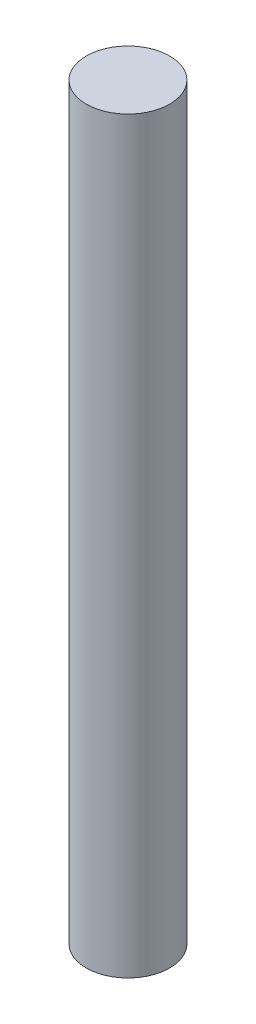
ISO-10303-21;
HEADER;
FILE_DESCRIPTION(('STEP AP214'),'2;1');
FILE_NAME('part.step','',(''),(''),'','','');
FILE_SCHEMA(('AUTOMOTIVE_DESIGN { 1 0 10303 214 1 1 1 1 }'));
ENDSEC;
DATA;
#1=APPLICATION_CONTEXT('core data for automotive mechanical design processes');
#2=APPLICATION_PROTOCOL_DEFINITION('international standard','automotive_design',2000,#1);
#3=PRODUCT_CONTEXT('',#1,'mechanical');
#4=PRODUCT('Part','Part','',(#3));
#5=PRODUCT_RELATED_PRODUCT_CATEGORY('part','',(#4));
#6=PRODUCT_DEFINITION_FORMATION('','',#4);
#7=PRODUCT_DEFINITION_CONTEXT('part definition',#1,'design');
#8=PRODUCT_DEFINITION('design','',#6,#7);
#9=PRODUCT_DEFINITION_SHAPE('','',#8);
#10=(LENGTH_UNIT() NAMED_UNIT(*) SI_UNIT(.MILLI.,.METRE.));
#11=(NAMED_UNIT(*) PLANE_ANGLE_UNIT() SI_UNIT($,.RADIAN.));
#12=(NAMED_UNIT(*) SI_UNIT($,.STERADIAN.) SOLID_ANGLE_UNIT());
#13=UNCERTAINTY_MEASURE_WITH_UNIT(LENGTH_MEASURE(1.E-05),#10,'distance_accuracy_value','');
#14=(GEOMETRIC_REPRESENTATION_CONTEXT(3) GLOBAL_UNCERTAINTY_ASSIGNED_CONTEXT((#13)) GLOBAL_UNIT_ASSIGNED_CONTEXT((#10,
#11,#12)) REPRESENTATION_CONTEXT('',''));
#15=CARTESIAN_POINT('',(0.,0.,0.));
#16=DIRECTION('',(0.,0.,1.));
#17=DIRECTION('',(1.,0.,0.));
#18=AXIS2_PLACEMENT_3D('',#15,#16,#17);
#19=CARTESIAN_POINT('',(0.,-370.,0.));
#20=DIRECTION('',(0.,1.,0.));
#21=DIRECTION('',(0.,0.,1.));
#22=AXIS2_PLACEMENT_3D('',#19,#20,#21);
#23=CYLINDRICAL_SURFACE('',#22,26.2);
#24=CARTESIAN_POINT('',(0.,-370.,0.));
#25=DIRECTION('',(0.,1.,0.));
#26=DIRECTION('',(0.,0.,1.));
#27=AXIS2_PLACEMENT_3D('',#24,#25,#26);
#28=CIRCLE('',#27,26.2);
#29=CARTESIAN_POINT('',(0.,-370.,26.2));
#30=VERTEX_POINT('',#29);
#31=EDGE_CURVE('E10',#30,#30,#28,.T.);
#32=ORIENTED_EDGE('',*,*,#31,.T.);
#33=EDGE_LOOP('',(#32));
#34=FACE_BOUND('',#33,.T.);
#35=CARTESIAN_POINT('',(0.,100.,0.));
#36=DIRECTION('',(0.,1.,0.));
#37=DIRECTION('',(0.,0.,1.));
#38=AXIS2_PLACEMENT_3D('',#35,#36,#37);
#39=CIRCLE('',#38,26.2);
#40=CARTESIAN_POINT('',(0.,100.,26.2));
#41=VERTEX_POINT('',#40);
#42=EDGE_CURVE('E48',#41,#41,#39,.T.);
#43=ORIENTED_EDGE('',*,*,#42,.F.);
#44=EDGE_LOOP('',(#43));
#45=FACE_BOUND('',#44,.T.);
#46=ADVANCED_FACE('F41',(#34,#45),#23,.T.);
#47=CARTESIAN_POINT('',(0.,-370.,0.));
#48=DIRECTION('',(0.,1.,0.));
#49=DIRECTION('',(0.,0.,1.));
#50=AXIS2_PLACEMENT_3D('',#47,#48,#49);
#51=PLANE('',#50);
#52=ORIENTED_EDGE('',*,*,#31,.F.);
#53=EDGE_LOOP('',(#52));
#54=FACE_BOUND('',#53,.T.);
#55=ADVANCED_FACE('F58',(#54),#51,.F.);
#56=CARTESIAN_POINT('',(0.,100.,0.));
#57=DIRECTION('',(0.,1.,0.));
#58=DIRECTION('',(0.,0.,1.));
#59=AXIS2_PLACEMENT_3D('',#56,#57,#58);
#60=PLANE('',#59);
#61=ORIENTED_EDGE('',*,*,#42,.T.);
#62=EDGE_LOOP('',(#61));
#63=FACE_BOUND('',#62,.T.);
#64=ADVANCED_FACE('F55',(#63),#60,.T.);
#65=CLOSED_SHELL('',(#46,#55,#64));
#66=MANIFOLD_SOLID_BREP('B2',#65);
#67=ADVANCED_BREP_SHAPE_REPRESENTATION('',(#18,#66),#14);
#68=SHAPE_DEFINITION_REPRESENTATION(#9,#67);
ENDSEC;
END-ISO-10303-21;
